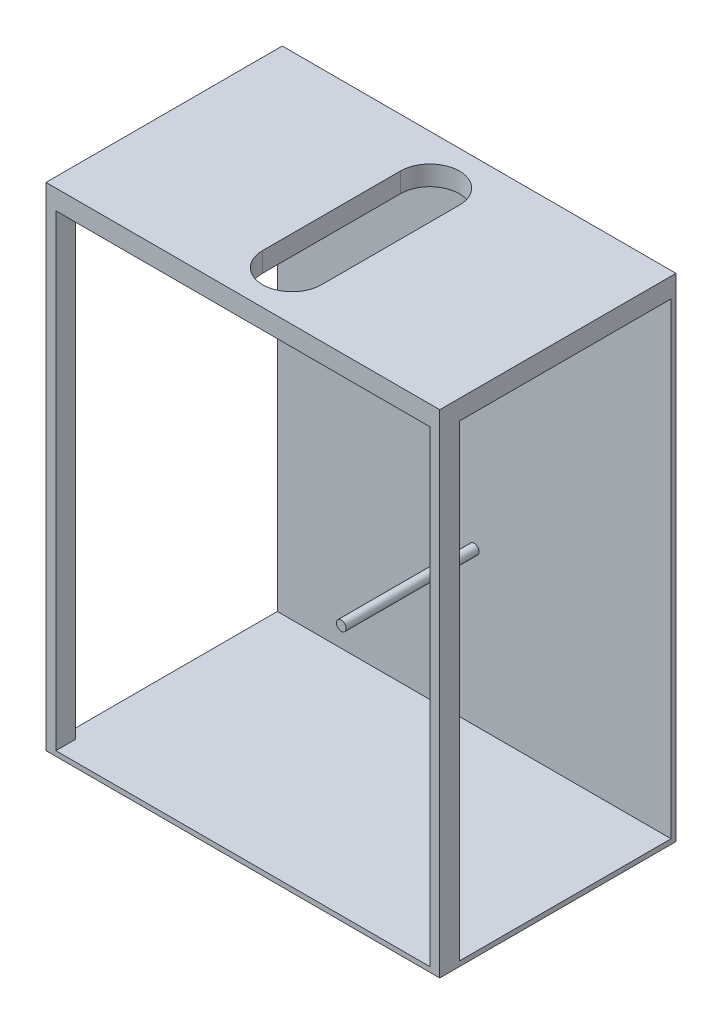
ISO-10303-21;
HEADER;
FILE_DESCRIPTION(('STEP AP214'),'2;1');
FILE_NAME('part.step','',(''),(''),'','','');
FILE_SCHEMA(('AUTOMOTIVE_DESIGN { 1 0 10303 214 1 1 1 1 }'));
ENDSEC;
DATA;
#1=APPLICATION_CONTEXT('core data for automotive mechanical design processes');
#2=APPLICATION_PROTOCOL_DEFINITION('international standard','automotive_design',2000,#1);
#3=PRODUCT_CONTEXT('',#1,'mechanical');
#4=PRODUCT('Part','Part','',(#3));
#5=PRODUCT_RELATED_PRODUCT_CATEGORY('part','',(#4));
#6=PRODUCT_DEFINITION_FORMATION('','',#4);
#7=PRODUCT_DEFINITION_CONTEXT('part definition',#1,'design');
#8=PRODUCT_DEFINITION('design','',#6,#7);
#9=PRODUCT_DEFINITION_SHAPE('','',#8);
#10=(LENGTH_UNIT() NAMED_UNIT(*) SI_UNIT(.MILLI.,.METRE.));
#11=(NAMED_UNIT(*) PLANE_ANGLE_UNIT() SI_UNIT($,.RADIAN.));
#12=(NAMED_UNIT(*) SI_UNIT($,.STERADIAN.) SOLID_ANGLE_UNIT());
#13=UNCERTAINTY_MEASURE_WITH_UNIT(LENGTH_MEASURE(1.E-05),#10,'distance_accuracy_value','');
#14=(GEOMETRIC_REPRESENTATION_CONTEXT(3) GLOBAL_UNCERTAINTY_ASSIGNED_CONTEXT((#13)) GLOBAL_UNIT_ASSIGNED_CONTEXT((#10,
#11,#12)) REPRESENTATION_CONTEXT('',''));
#15=CARTESIAN_POINT('',(0.,0.,0.));
#16=DIRECTION('',(0.,0.,1.));
#17=DIRECTION('',(1.,0.,0.));
#18=AXIS2_PLACEMENT_3D('',#15,#16,#17);
#19=CARTESIAN_POINT('',(0.,0.,6.35));
#20=DIRECTION('',(0.,0.,-1.));
#21=DIRECTION('',(-1.,0.,0.));
#22=AXIS2_PLACEMENT_3D('',#19,#20,#21);
#23=PLANE('',#22);
#24=CARTESIAN_POINT('',(254.,203.2,6.34999999999999));
#25=DIRECTION('',(0.,0.,-1.));
#26=DIRECTION('',(-1.,0.,0.));
#27=AXIS2_PLACEMENT_3D('',#24,#25,#26);
#28=CIRCLE('',#27,6.34999999999999);
#29=CARTESIAN_POINT('',(247.65,203.2,6.34999999999999));
#30=VERTEX_POINT('',#29);
#31=EDGE_CURVE('E11',#30,#30,#28,.F.);
#32=ORIENTED_EDGE('',*,*,#31,.F.);
#33=EDGE_LOOP('',(#32));
#34=FACE_BOUND('',#33,.T.);
#35=DIRECTION('',(0.,1.,0.));
#36=VECTOR('',#35,1.);
#37=CARTESIAN_POINT('',(508.,0.,6.35));
#38=LINE('',#37,#36);
#39=CARTESIAN_POINT('',(508.,6.35,6.35));
#40=VERTEX_POINT('',#39);
#41=CARTESIAN_POINT('',(508.,609.6,6.35));
#42=VERTEX_POINT('',#41);
#43=EDGE_CURVE('E298',#40,#42,#38,.T.);
#44=ORIENTED_EDGE('',*,*,#43,.T.);
#45=DIRECTION('',(-1.,0.,0.));
#46=VECTOR('',#45,1.);
#47=CARTESIAN_POINT('',(12.7,609.6,6.35));
#48=LINE('',#47,#46);
#49=CARTESIAN_POINT('',(0.,609.6,6.35));
#50=VERTEX_POINT('',#49);
#51=EDGE_CURVE('E252',#42,#50,#48,.T.);
#52=ORIENTED_EDGE('',*,*,#51,.T.);
#53=DIRECTION('',(0.,-1.,0.));
#54=VECTOR('',#53,1.);
#55=CARTESIAN_POINT('',(0.,0.,6.35));
#56=LINE('',#55,#54);
#57=CARTESIAN_POINT('',(0.,6.35,6.35));
#58=VERTEX_POINT('',#57);
#59=EDGE_CURVE('E295',#50,#58,#56,.T.);
#60=ORIENTED_EDGE('',*,*,#59,.T.);
#61=DIRECTION('',(-1.,0.,0.));
#62=VECTOR('',#61,1.);
#63=CARTESIAN_POINT('',(0.,6.35,6.35));
#64=LINE('',#63,#62);
#65=EDGE_CURVE('E275',#40,#58,#64,.T.);
#66=ORIENTED_EDGE('',*,*,#65,.F.);
#67=EDGE_LOOP('',(#44,#52,#60,#66));
#68=FACE_BOUND('',#67,.T.);
#69=ADVANCED_FACE('F43',(#34,#68),#23,.F.);
#70=CARTESIAN_POINT('',(12.7,0.,0.));
#71=DIRECTION('',(-1.,0.,0.));
#72=DIRECTION('',(0.,0.,1.));
#73=AXIS2_PLACEMENT_3D('',#70,#71,#72);
#74=PLANE('',#73);
#75=DIRECTION('',(0.,0.,-1.));
#76=VECTOR('',#75,1.);
#77=CARTESIAN_POINT('',(12.7,609.6,304.8));
#78=LINE('',#77,#76);
#79=CARTESIAN_POINT('',(12.7,609.6,304.8));
#80=VERTEX_POINT('',#79);
#81=CARTESIAN_POINT('',(12.7,609.6,279.4));
#82=VERTEX_POINT('',#81);
#83=EDGE_CURVE('E198',#80,#82,#78,.T.);
#84=ORIENTED_EDGE('',*,*,#83,.F.);
#85=DIRECTION('',(0.,-1.,0.));
#86=VECTOR('',#85,1.);
#87=CARTESIAN_POINT('',(12.7,6.35,304.8));
#88=LINE('',#87,#86);
#89=CARTESIAN_POINT('',(12.7,6.35,304.8));
#90=VERTEX_POINT('',#89);
#91=EDGE_CURVE('E240',#80,#90,#88,.T.);
#92=ORIENTED_EDGE('',*,*,#91,.T.);
#93=DIRECTION('',(0.,0.,-1.));
#94=VECTOR('',#93,1.);
#95=CARTESIAN_POINT('',(12.7,6.34999999999997,279.4));
#96=LINE('',#95,#94);
#97=CARTESIAN_POINT('',(12.7,6.35,279.4));
#98=VERTEX_POINT('',#97);
#99=EDGE_CURVE('E231',#90,#98,#96,.T.);
#100=ORIENTED_EDGE('',*,*,#99,.T.);
#101=DIRECTION('',(0.,1.,0.));
#102=VECTOR('',#101,1.);
#103=CARTESIAN_POINT('',(12.7,609.6,279.4));
#104=LINE('',#103,#102);
#105=EDGE_CURVE('E235',#98,#82,#104,.T.);
#106=ORIENTED_EDGE('',*,*,#105,.T.);
#107=EDGE_LOOP('',(#84,#92,#100,#106));
#108=FACE_BOUND('',#107,.T.);
#109=ADVANCED_FACE('F360',(#108),#74,.F.);
#110=CARTESIAN_POINT('',(495.3,0.,0.));
#111=DIRECTION('',(1.,0.,0.));
#112=DIRECTION('',(0.,0.,1.));
#113=AXIS2_PLACEMENT_3D('',#110,#111,#112);
#114=PLANE('',#113);
#115=DIRECTION('',(0.,0.,-1.));
#116=VECTOR('',#115,1.);
#117=CARTESIAN_POINT('',(495.3,609.6,304.8));
#118=LINE('',#117,#116);
#119=CARTESIAN_POINT('',(495.3,609.6,304.8));
#120=VERTEX_POINT('',#119);
#121=CARTESIAN_POINT('',(495.3,609.6,279.4));
#122=VERTEX_POINT('',#121);
#123=EDGE_CURVE('E201',#120,#122,#118,.T.);
#124=ORIENTED_EDGE('',*,*,#123,.T.);
#125=DIRECTION('',(0.,1.,0.));
#126=VECTOR('',#125,1.);
#127=CARTESIAN_POINT('',(495.3,609.6,279.4));
#128=LINE('',#127,#126);
#129=CARTESIAN_POINT('',(495.3,6.35,279.4));
#130=VERTEX_POINT('',#129);
#131=EDGE_CURVE('E214',#130,#122,#128,.T.);
#132=ORIENTED_EDGE('',*,*,#131,.F.);
#133=DIRECTION('',(0.,0.,-1.));
#134=VECTOR('',#133,1.);
#135=CARTESIAN_POINT('',(495.3,6.34999999999997,279.4));
#136=LINE('',#135,#134);
#137=CARTESIAN_POINT('',(495.3,6.35,304.8));
#138=VERTEX_POINT('',#137);
#139=EDGE_CURVE('E207',#138,#130,#136,.T.);
#140=ORIENTED_EDGE('',*,*,#139,.F.);
#141=DIRECTION('',(0.,-1.,0.));
#142=VECTOR('',#141,1.);
#143=CARTESIAN_POINT('',(495.3,6.35,304.8));
#144=LINE('',#143,#142);
#145=EDGE_CURVE('E210',#120,#138,#144,.T.);
#146=ORIENTED_EDGE('',*,*,#145,.F.);
#147=EDGE_LOOP('',(#124,#132,#140,#146));
#148=FACE_BOUND('',#147,.T.);
#149=ADVANCED_FACE('F366',(#148),#114,.F.);
#150=CARTESIAN_POINT('',(0.,6.35,0.));
#151=DIRECTION('',(0.,1.,0.));
#152=DIRECTION('',(0.,0.,1.));
#153=AXIS2_PLACEMENT_3D('',#150,#151,#152);
#154=PLANE('',#153);
#155=DIRECTION('',(1.,0.,0.));
#156=VECTOR('',#155,1.);
#157=CARTESIAN_POINT('',(495.3,6.34999999999997,279.4));
#158=LINE('',#157,#156);
#159=CARTESIAN_POINT('',(508.,6.35,279.4));
#160=VERTEX_POINT('',#159);
#161=EDGE_CURVE('E218',#130,#160,#158,.T.);
#162=ORIENTED_EDGE('',*,*,#161,.T.);
#163=DIRECTION('',(0.,0.,-1.));
#164=VECTOR('',#163,1.);
#165=CARTESIAN_POINT('',(508.,6.35,6.35));
#166=LINE('',#165,#164);
#167=EDGE_CURVE('E272',#160,#40,#166,.T.);
#168=ORIENTED_EDGE('',*,*,#167,.T.);
#169=ORIENTED_EDGE('',*,*,#65,.T.);
#170=DIRECTION('',(0.,0.,1.));
#171=VECTOR('',#170,1.);
#172=CARTESIAN_POINT('',(0.,6.35,6.35));
#173=LINE('',#172,#171);
#174=CARTESIAN_POINT('',(0.,6.35,279.4));
#175=VERTEX_POINT('',#174);
#176=EDGE_CURVE('E265',#58,#175,#173,.T.);
#177=ORIENTED_EDGE('',*,*,#176,.T.);
#178=DIRECTION('',(-1.,0.,0.));
#179=VECTOR('',#178,1.);
#180=CARTESIAN_POINT('',(12.7,6.34999999999997,279.4));
#181=LINE('',#180,#179);
#182=EDGE_CURVE('E260',#98,#175,#181,.T.);
#183=ORIENTED_EDGE('',*,*,#182,.F.);
#184=ORIENTED_EDGE('',*,*,#99,.F.);
#185=DIRECTION('',(1.,0.,0.));
#186=VECTOR('',#185,1.);
#187=CARTESIAN_POINT('',(0.,6.35,304.8));
#188=LINE('',#187,#186);
#189=EDGE_CURVE('E268',#90,#138,#188,.T.);
#190=ORIENTED_EDGE('',*,*,#189,.T.);
#191=ORIENTED_EDGE('',*,*,#139,.T.);
#192=EDGE_LOOP('',(#162,#168,#169,#177,#183,#184,#190,#191));
#193=FACE_BOUND('',#192,.T.);
#194=ADVANCED_FACE('F383',(#193),#154,.T.);
#195=CARTESIAN_POINT('',(0.,0.,6.35));
#196=DIRECTION('',(1.,0.,0.));
#197=DIRECTION('',(0.,0.,-1.));
#198=AXIS2_PLACEMENT_3D('',#195,#196,#197);
#199=PLANE('',#198);
#200=ORIENTED_EDGE('',*,*,#59,.F.);
#201=DIRECTION('',(0.,0.,-1.));
#202=VECTOR('',#201,1.);
#203=CARTESIAN_POINT('',(0.,609.6,6.35));
#204=LINE('',#203,#202);
#205=CARTESIAN_POINT('',(0.,609.6,279.4));
#206=VERTEX_POINT('',#205);
#207=EDGE_CURVE('E236',#206,#50,#204,.T.);
#208=ORIENTED_EDGE('',*,*,#207,.F.);
#209=DIRECTION('',(0.,1.,0.));
#210=VECTOR('',#209,1.);
#211=CARTESIAN_POINT('',(0.,609.6,279.4));
#212=LINE('',#211,#210);
#213=EDGE_CURVE('E230',#175,#206,#212,.T.);
#214=ORIENTED_EDGE('',*,*,#213,.F.);
#215=ORIENTED_EDGE('',*,*,#176,.F.);
#216=EDGE_LOOP('',(#200,#208,#214,#215));
#217=FACE_BOUND('',#216,.T.);
#218=DIRECTION('',(0.,-1.,0.));
#219=VECTOR('',#218,1.);
#220=CARTESIAN_POINT('',(0.,0.,0.));
#221=LINE('',#220,#219);
#222=CARTESIAN_POINT('',(0.,635.,0.));
#223=VERTEX_POINT('',#222);
#224=CARTESIAN_POINT('',(0.,0.,0.));
#225=VERTEX_POINT('',#224);
#226=EDGE_CURVE('E293',#223,#225,#221,.T.);
#227=ORIENTED_EDGE('',*,*,#226,.T.);
#228=DIRECTION('',(0.,0.,-1.));
#229=VECTOR('',#228,1.);
#230=CARTESIAN_POINT('',(0.,0.,6.35));
#231=LINE('',#230,#229);
#232=CARTESIAN_POINT('',(0.,0.,304.8));
#233=VERTEX_POINT('',#232);
#234=EDGE_CURVE('E47',#233,#225,#231,.T.);
#235=ORIENTED_EDGE('',*,*,#234,.F.);
#236=DIRECTION('',(0.,-1.,0.));
#237=VECTOR('',#236,1.);
#238=CARTESIAN_POINT('',(0.,6.35,304.8));
#239=LINE('',#238,#237);
#240=CARTESIAN_POINT('',(0.,635.,304.8));
#241=VERTEX_POINT('',#240);
#242=EDGE_CURVE('E286',#241,#233,#239,.T.);
#243=ORIENTED_EDGE('',*,*,#242,.F.);
#244=DIRECTION('',(0.,0.,-1.));
#245=VECTOR('',#244,1.);
#246=CARTESIAN_POINT('',(0.,635.,6.35));
#247=LINE('',#246,#245);
#248=EDGE_CURVE('E303',#241,#223,#247,.T.);
#249=ORIENTED_EDGE('',*,*,#248,.T.);
#250=EDGE_LOOP('',(#227,#235,#243,#249));
#251=FACE_BOUND('',#250,.T.);
#252=ADVANCED_FACE('F45',(#217,#251),#199,.F.);
#253=CARTESIAN_POINT('',(0.,0.,6.35));
#254=DIRECTION('',(0.,1.,0.));
#255=DIRECTION('',(0.,0.,1.));
#256=AXIS2_PLACEMENT_3D('',#253,#254,#255);
#257=PLANE('',#256);
#258=DIRECTION('',(1.,0.,0.));
#259=VECTOR('',#258,1.);
#260=CARTESIAN_POINT('',(0.,0.,0.));
#261=LINE('',#260,#259);
#262=CARTESIAN_POINT('',(508.,0.,0.));
#263=VERTEX_POINT('',#262);
#264=EDGE_CURVE('E307',#225,#263,#261,.T.);
#265=ORIENTED_EDGE('',*,*,#264,.T.);
#266=DIRECTION('',(0.,0.,-1.));
#267=VECTOR('',#266,1.);
#268=CARTESIAN_POINT('',(508.,0.,6.35));
#269=LINE('',#268,#267);
#270=CARTESIAN_POINT('',(508.,0.,304.8));
#271=VERTEX_POINT('',#270);
#272=EDGE_CURVE('E321',#271,#263,#269,.T.);
#273=ORIENTED_EDGE('',*,*,#272,.F.);
#274=DIRECTION('',(1.,0.,0.));
#275=VECTOR('',#274,1.);
#276=CARTESIAN_POINT('',(0.,0.,304.8));
#277=LINE('',#276,#275);
#278=EDGE_CURVE('E264',#233,#271,#277,.T.);
#279=ORIENTED_EDGE('',*,*,#278,.F.);
#280=ORIENTED_EDGE('',*,*,#234,.T.);
#281=EDGE_LOOP('',(#265,#273,#279,#280));
#282=FACE_BOUND('',#281,.T.);
#283=ADVANCED_FACE('F330',(#282),#257,.F.);
#284=CARTESIAN_POINT('',(508.,0.,6.35));
#285=DIRECTION('',(-1.,0.,0.));
#286=DIRECTION('',(0.,0.,1.));
#287=AXIS2_PLACEMENT_3D('',#284,#285,#286);
#288=PLANE('',#287);
#289=ORIENTED_EDGE('',*,*,#167,.F.);
#290=DIRECTION('',(0.,1.,0.));
#291=VECTOR('',#290,1.);
#292=CARTESIAN_POINT('',(508.,609.6,279.4));
#293=LINE('',#292,#291);
#294=CARTESIAN_POINT('',(508.,609.6,279.4));
#295=VERTEX_POINT('',#294);
#296=EDGE_CURVE('E211',#160,#295,#293,.T.);
#297=ORIENTED_EDGE('',*,*,#296,.T.);
#298=DIRECTION('',(0.,0.,-1.));
#299=VECTOR('',#298,1.);
#300=CARTESIAN_POINT('',(508.,609.6,6.35));
#301=LINE('',#300,#299);
#302=EDGE_CURVE('E204',#295,#42,#301,.T.);
#303=ORIENTED_EDGE('',*,*,#302,.T.);
#304=ORIENTED_EDGE('',*,*,#43,.F.);
#305=EDGE_LOOP('',(#289,#297,#303,#304));
#306=FACE_BOUND('',#305,.T.);
#307=DIRECTION('',(0.,1.,0.));
#308=VECTOR('',#307,1.);
#309=CARTESIAN_POINT('',(508.,0.,0.));
#310=LINE('',#309,#308);
#311=CARTESIAN_POINT('',(508.,635.,0.));
#312=VERTEX_POINT('',#311);
#313=EDGE_CURVE('E310',#263,#312,#310,.T.);
#314=ORIENTED_EDGE('',*,*,#313,.T.);
#315=DIRECTION('',(0.,0.,-1.));
#316=VECTOR('',#315,1.);
#317=CARTESIAN_POINT('',(508.,635.,6.35));
#318=LINE('',#317,#316);
#319=CARTESIAN_POINT('',(508.,635.,304.8));
#320=VERTEX_POINT('',#319);
#321=EDGE_CURVE('E318',#320,#312,#318,.T.);
#322=ORIENTED_EDGE('',*,*,#321,.F.);
#323=DIRECTION('',(0.,-1.,0.));
#324=VECTOR('',#323,1.);
#325=CARTESIAN_POINT('',(508.,6.35,304.8));
#326=LINE('',#325,#324);
#327=EDGE_CURVE('E279',#320,#271,#326,.T.);
#328=ORIENTED_EDGE('',*,*,#327,.T.);
#329=ORIENTED_EDGE('',*,*,#272,.T.);
#330=EDGE_LOOP('',(#314,#322,#328,#329));
#331=FACE_BOUND('',#330,.T.);
#332=ADVANCED_FACE('F338',(#306,#331),#288,.F.);
#333=CARTESIAN_POINT('',(0.,635.,6.35));
#334=DIRECTION('',(0.,-1.,0.));
#335=DIRECTION('',(0.,0.,-1.));
#336=AXIS2_PLACEMENT_3D('',#333,#334,#335);
#337=PLANE('',#336);
#338=DIRECTION('',(0.,0.,1.));
#339=VECTOR('',#338,1.);
#340=CARTESIAN_POINT('',(215.9,635.,63.5));
#341=LINE('',#340,#339);
#342=CARTESIAN_POINT('',(215.9,635.,63.5));
#343=VERTEX_POINT('',#342);
#344=CARTESIAN_POINT('',(215.9,635.,241.3));
#345=VERTEX_POINT('',#344);
#346=EDGE_CURVE('E171',#343,#345,#341,.T.);
#347=ORIENTED_EDGE('',*,*,#346,.F.);
#348=CARTESIAN_POINT('',(254.,635.,63.5));
#349=DIRECTION('',(0.,1.,0.));
#350=DIRECTION('',(0.,0.,1.));
#351=AXIS2_PLACEMENT_3D('',#348,#349,#350);
#352=CIRCLE('',#351,38.1000000000001);
#353=CARTESIAN_POINT('',(292.1,635.,63.5));
#354=VERTEX_POINT('',#353);
#355=EDGE_CURVE('E60',#354,#343,#352,.T.);
#356=ORIENTED_EDGE('',*,*,#355,.F.);
#357=DIRECTION('',(0.,0.,-1.));
#358=VECTOR('',#357,1.);
#359=CARTESIAN_POINT('',(292.1,635.,63.5));
#360=LINE('',#359,#358);
#361=CARTESIAN_POINT('',(292.1,635.,241.3));
#362=VERTEX_POINT('',#361);
#363=EDGE_CURVE('E179',#362,#354,#360,.T.);
#364=ORIENTED_EDGE('',*,*,#363,.F.);
#365=CARTESIAN_POINT('',(254.,635.,241.3));
#366=DIRECTION('',(0.,1.,0.));
#367=DIRECTION('',(0.,0.,1.));
#368=AXIS2_PLACEMENT_3D('',#365,#366,#367);
#369=CIRCLE('',#368,38.1000000000001);
#370=EDGE_CURVE('E161',#345,#362,#369,.T.);
#371=ORIENTED_EDGE('',*,*,#370,.F.);
#372=EDGE_LOOP('',(#347,#356,#364,#371));
#373=FACE_BOUND('',#372,.T.);
#374=DIRECTION('',(-1.,0.,0.));
#375=VECTOR('',#374,1.);
#376=CARTESIAN_POINT('',(12.7,635.,304.8));
#377=LINE('',#376,#375);
#378=EDGE_CURVE('E243',#320,#241,#377,.T.);
#379=ORIENTED_EDGE('',*,*,#378,.F.);
#380=ORIENTED_EDGE('',*,*,#321,.T.);
#381=DIRECTION('',(-1.,0.,0.));
#382=VECTOR('',#381,1.);
#383=CARTESIAN_POINT('',(0.,635.,0.));
#384=LINE('',#383,#382);
#385=EDGE_CURVE('E299',#312,#223,#384,.T.);
#386=ORIENTED_EDGE('',*,*,#385,.T.);
#387=ORIENTED_EDGE('',*,*,#248,.F.);
#388=EDGE_LOOP('',(#379,#380,#386,#387));
#389=FACE_BOUND('',#388,.T.);
#390=ADVANCED_FACE('F176',(#373,#389),#337,.F.);
#391=CARTESIAN_POINT('',(0.,0.,0.));
#392=DIRECTION('',(0.,0.,-1.));
#393=DIRECTION('',(-1.,0.,0.));
#394=AXIS2_PLACEMENT_3D('',#391,#392,#393);
#395=PLANE('',#394);
#396=ORIENTED_EDGE('',*,*,#226,.F.);
#397=ORIENTED_EDGE('',*,*,#385,.F.);
#398=ORIENTED_EDGE('',*,*,#313,.F.);
#399=ORIENTED_EDGE('',*,*,#264,.F.);
#400=EDGE_LOOP('',(#396,#397,#398,#399));
#401=FACE_BOUND('',#400,.T.);
#402=ADVANCED_FACE('F336',(#401),#395,.T.);
#403=CARTESIAN_POINT('',(254.,203.2,177.8));
#404=DIRECTION('',(0.,0.,-1.));
#405=DIRECTION('',(-1.,0.,0.));
#406=AXIS2_PLACEMENT_3D('',#403,#404,#405);
#407=CYLINDRICAL_SURFACE('',#406,6.34999999999999);
#408=CARTESIAN_POINT('',(254.,203.2,177.8));
#409=DIRECTION('',(0.,0.,1.));
#410=DIRECTION('',(1.,0.,0.));
#411=AXIS2_PLACEMENT_3D('',#408,#409,#410);
#412=CIRCLE('',#411,6.34999999999999);
#413=CARTESIAN_POINT('',(260.35,203.2,177.8));
#414=VERTEX_POINT('',#413);
#415=EDGE_CURVE('E290',#414,#414,#412,.T.);
#416=ORIENTED_EDGE('',*,*,#415,.F.);
#417=EDGE_LOOP('',(#416));
#418=FACE_BOUND('',#417,.T.);
#419=ORIENTED_EDGE('',*,*,#31,.T.);
#420=EDGE_LOOP('',(#419));
#421=FACE_BOUND('',#420,.T.);
#422=ADVANCED_FACE('F354',(#418,#421),#407,.T.);
#423=CARTESIAN_POINT('',(254.,203.2,177.8));
#424=DIRECTION('',(0.,0.,1.));
#425=DIRECTION('',(1.,0.,0.));
#426=AXIS2_PLACEMENT_3D('',#423,#424,#425);
#427=PLANE('',#426);
#428=ORIENTED_EDGE('',*,*,#415,.T.);
#429=EDGE_LOOP('',(#428));
#430=FACE_BOUND('',#429,.T.);
#431=ADVANCED_FACE('F344',(#430),#427,.T.);
#432=CARTESIAN_POINT('',(0.,6.35,304.8));
#433=DIRECTION('',(0.,0.,-1.));
#434=DIRECTION('',(-1.,0.,0.));
#435=AXIS2_PLACEMENT_3D('',#432,#433,#434);
#436=PLANE('',#435);
#437=ORIENTED_EDGE('',*,*,#91,.F.);
#438=DIRECTION('',(-1.,0.,0.));
#439=VECTOR('',#438,1.);
#440=CARTESIAN_POINT('',(794.828900942797,609.6,304.8));
#441=LINE('',#440,#439);
#442=EDGE_CURVE('E196',#120,#80,#441,.T.);
#443=ORIENTED_EDGE('',*,*,#442,.F.);
#444=ORIENTED_EDGE('',*,*,#145,.T.);
#445=ORIENTED_EDGE('',*,*,#189,.F.);
#446=EDGE_LOOP('',(#437,#443,#444,#445));
#447=FACE_BOUND('',#446,.T.);
#448=ORIENTED_EDGE('',*,*,#278,.T.);
#449=ORIENTED_EDGE('',*,*,#327,.F.);
#450=ORIENTED_EDGE('',*,*,#378,.T.);
#451=ORIENTED_EDGE('',*,*,#242,.T.);
#452=EDGE_LOOP('',(#448,#449,#450,#451));
#453=FACE_BOUND('',#452,.T.);
#454=ADVANCED_FACE('F341',(#447,#453),#436,.F.);
#455=CARTESIAN_POINT('',(12.7,609.6,279.4));
#456=DIRECTION('',(0.,0.,1.));
#457=DIRECTION('',(0.,-1.,0.));
#458=AXIS2_PLACEMENT_3D('',#455,#456,#457);
#459=PLANE('',#458);
#460=ORIENTED_EDGE('',*,*,#213,.T.);
#461=DIRECTION('',(-1.,0.,0.));
#462=VECTOR('',#461,1.);
#463=CARTESIAN_POINT('',(12.7,609.6,279.4));
#464=LINE('',#463,#462);
#465=EDGE_CURVE('E256',#82,#206,#464,.T.);
#466=ORIENTED_EDGE('',*,*,#465,.F.);
#467=ORIENTED_EDGE('',*,*,#105,.F.);
#468=ORIENTED_EDGE('',*,*,#182,.T.);
#469=EDGE_LOOP('',(#460,#466,#467,#468));
#470=FACE_BOUND('',#469,.T.);
#471=ADVANCED_FACE('F343',(#470),#459,.F.);
#472=CARTESIAN_POINT('',(12.7,609.6,6.35));
#473=DIRECTION('',(0.,1.,0.));
#474=DIRECTION('',(0.,0.,1.));
#475=AXIS2_PLACEMENT_3D('',#472,#473,#474);
#476=PLANE('',#475);
#477=DIRECTION('',(0.,0.,1.));
#478=VECTOR('',#477,1.);
#479=CARTESIAN_POINT('',(292.1,609.6,63.5));
#480=LINE('',#479,#478);
#481=CARTESIAN_POINT('',(292.1,609.6,63.5));
#482=VERTEX_POINT('',#481);
#483=CARTESIAN_POINT('',(292.1,609.6,241.3));
#484=VERTEX_POINT('',#483);
#485=EDGE_CURVE('E428',#482,#484,#480,.T.);
#486=ORIENTED_EDGE('',*,*,#485,.F.);
#487=CARTESIAN_POINT('',(254.,609.6,63.5));
#488=DIRECTION('',(0.,1.,0.));
#489=DIRECTION('',(0.,0.,1.));
#490=AXIS2_PLACEMENT_3D('',#487,#488,#489);
#491=CIRCLE('',#490,38.1000000000001);
#492=CARTESIAN_POINT('',(215.9,609.6,63.5));
#493=VERTEX_POINT('',#492);
#494=EDGE_CURVE('E197',#493,#482,#491,.F.);
#495=ORIENTED_EDGE('',*,*,#494,.F.);
#496=DIRECTION('',(0.,0.,-1.));
#497=VECTOR('',#496,1.);
#498=CARTESIAN_POINT('',(215.9,609.6,63.5));
#499=LINE('',#498,#497);
#500=CARTESIAN_POINT('',(215.9,609.6,241.3));
#501=VERTEX_POINT('',#500);
#502=EDGE_CURVE('E193',#501,#493,#499,.T.);
#503=ORIENTED_EDGE('',*,*,#502,.F.);
#504=CARTESIAN_POINT('',(254.,609.6,241.3));
#505=DIRECTION('',(0.,1.,0.));
#506=DIRECTION('',(0.,0.,1.));
#507=AXIS2_PLACEMENT_3D('',#504,#505,#506);
#508=CIRCLE('',#507,38.1000000000001);
#509=EDGE_CURVE('E164',#484,#501,#508,.F.);
#510=ORIENTED_EDGE('',*,*,#509,.F.);
#511=EDGE_LOOP('',(#486,#495,#503,#510));
#512=FACE_BOUND('',#511,.T.);
#513=ORIENTED_EDGE('',*,*,#207,.T.);
#514=ORIENTED_EDGE('',*,*,#51,.F.);
#515=ORIENTED_EDGE('',*,*,#302,.F.);
#516=DIRECTION('',(1.,0.,0.));
#517=VECTOR('',#516,1.);
#518=CARTESIAN_POINT('',(495.3,609.6,279.4));
#519=LINE('',#518,#517);
#520=EDGE_CURVE('E227',#122,#295,#519,.T.);
#521=ORIENTED_EDGE('',*,*,#520,.F.);
#522=ORIENTED_EDGE('',*,*,#123,.F.);
#523=ORIENTED_EDGE('',*,*,#442,.T.);
#524=ORIENTED_EDGE('',*,*,#83,.T.);
#525=ORIENTED_EDGE('',*,*,#465,.T.);
#526=EDGE_LOOP('',(#513,#514,#515,#521,#522,#523,#524,#525));
#527=FACE_BOUND('',#526,.T.);
#528=ADVANCED_FACE('F351',(#512,#527),#476,.F.);
#529=CARTESIAN_POINT('',(495.3,609.6,279.4));
#530=DIRECTION('',(0.,0.,-1.));
#531=DIRECTION('',(0.,1.,0.));
#532=AXIS2_PLACEMENT_3D('',#529,#530,#531);
#533=PLANE('',#532);
#534=ORIENTED_EDGE('',*,*,#296,.F.);
#535=ORIENTED_EDGE('',*,*,#161,.F.);
#536=ORIENTED_EDGE('',*,*,#131,.T.);
#537=ORIENTED_EDGE('',*,*,#520,.T.);
#538=EDGE_LOOP('',(#534,#535,#536,#537));
#539=FACE_BOUND('',#538,.T.);
#540=ADVANCED_FACE('F408',(#539),#533,.T.);
#541=CARTESIAN_POINT('',(254.,344.416214673672,63.5));
#542=DIRECTION('',(0.,1.,0.));
#543=DIRECTION('',(0.,0.,1.));
#544=AXIS2_PLACEMENT_3D('',#541,#542,#543);
#545=CYLINDRICAL_SURFACE('',#544,38.1000000000001);
#546=ORIENTED_EDGE('',*,*,#494,.T.);
#547=DIRECTION('',(0.,1.,0.));
#548=VECTOR('',#547,1.);
#549=CARTESIAN_POINT('',(292.1,344.416214673672,63.5));
#550=LINE('',#549,#548);
#551=EDGE_CURVE('E186',#482,#354,#550,.T.);
#552=ORIENTED_EDGE('',*,*,#551,.T.);
#553=ORIENTED_EDGE('',*,*,#355,.T.);
#554=DIRECTION('',(0.,1.,0.));
#555=VECTOR('',#554,1.);
#556=CARTESIAN_POINT('',(215.9,344.416214673672,63.5));
#557=LINE('',#556,#555);
#558=EDGE_CURVE('E168',#493,#343,#557,.T.);
#559=ORIENTED_EDGE('',*,*,#558,.F.);
#560=EDGE_LOOP('',(#546,#552,#553,#559));
#561=FACE_BOUND('',#560,.T.);
#562=ADVANCED_FACE('F418',(#561),#545,.F.);
#563=CARTESIAN_POINT('',(292.1,344.416214673672,63.5));
#564=DIRECTION('',(1.,0.,0.));
#565=DIRECTION('',(0.,0.,-1.));
#566=AXIS2_PLACEMENT_3D('',#563,#564,#565);
#567=PLANE('',#566);
#568=ORIENTED_EDGE('',*,*,#485,.T.);
#569=DIRECTION('',(0.,1.,0.));
#570=VECTOR('',#569,1.);
#571=CARTESIAN_POINT('',(292.1,344.416214673672,241.3));
#572=LINE('',#571,#570);
#573=EDGE_CURVE('E167',#484,#362,#572,.T.);
#574=ORIENTED_EDGE('',*,*,#573,.T.);
#575=ORIENTED_EDGE('',*,*,#363,.T.);
#576=ORIENTED_EDGE('',*,*,#551,.F.);
#577=EDGE_LOOP('',(#568,#574,#575,#576));
#578=FACE_BOUND('',#577,.T.);
#579=ADVANCED_FACE('F438',(#578),#567,.F.);
#580=CARTESIAN_POINT('',(254.,344.416214673672,241.3));
#581=DIRECTION('',(0.,1.,0.));
#582=DIRECTION('',(0.,0.,1.));
#583=AXIS2_PLACEMENT_3D('',#580,#581,#582);
#584=CYLINDRICAL_SURFACE('',#583,38.1000000000001);
#585=ORIENTED_EDGE('',*,*,#509,.T.);
#586=DIRECTION('',(0.,1.,0.));
#587=VECTOR('',#586,1.);
#588=CARTESIAN_POINT('',(215.9,344.416214673672,241.3));
#589=LINE('',#588,#587);
#590=EDGE_CURVE('E68',#501,#345,#589,.T.);
#591=ORIENTED_EDGE('',*,*,#590,.T.);
#592=ORIENTED_EDGE('',*,*,#370,.T.);
#593=ORIENTED_EDGE('',*,*,#573,.F.);
#594=EDGE_LOOP('',(#585,#591,#592,#593));
#595=FACE_BOUND('',#594,.T.);
#596=ADVANCED_FACE('F158',(#595),#584,.F.);
#597=CARTESIAN_POINT('',(215.9,344.416214673672,63.5));
#598=DIRECTION('',(-1.,0.,0.));
#599=DIRECTION('',(0.,0.,1.));
#600=AXIS2_PLACEMENT_3D('',#597,#598,#599);
#601=PLANE('',#600);
#602=ORIENTED_EDGE('',*,*,#502,.T.);
#603=ORIENTED_EDGE('',*,*,#558,.T.);
#604=ORIENTED_EDGE('',*,*,#346,.T.);
#605=ORIENTED_EDGE('',*,*,#590,.F.);
#606=EDGE_LOOP('',(#602,#603,#604,#605));
#607=FACE_BOUND('',#606,.T.);
#608=ADVANCED_FACE('F172',(#607),#601,.F.);
#609=CLOSED_SHELL('',(#69,#109,#149,#194,#252,#283,#332,#390,#402,#422,#431,#454,#471,#528,#540,
#562,#579,#596,#608));
#610=MANIFOLD_SOLID_BREP('B2',#609);
#611=ADVANCED_BREP_SHAPE_REPRESENTATION('',(#18,#610),#14);
#612=SHAPE_DEFINITION_REPRESENTATION(#9,#611);
ENDSEC;
END-ISO-10303-21;
